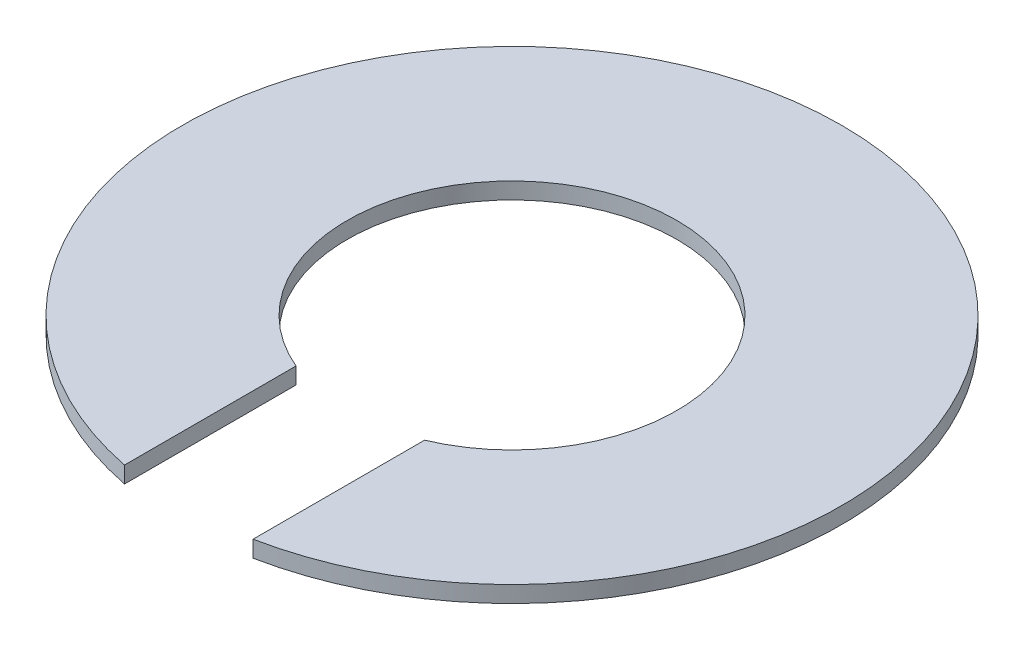
ISO-10303-21;
HEADER;
FILE_DESCRIPTION(('STEP AP214'),'2;1');
FILE_NAME('part.step','',(''),(''),'','','');
FILE_SCHEMA(('AUTOMOTIVE_DESIGN { 1 0 10303 214 1 1 1 1 }'));
ENDSEC;
DATA;
#1=APPLICATION_CONTEXT('core data for automotive mechanical design processes');
#2=APPLICATION_PROTOCOL_DEFINITION('international standard','automotive_design',2000,#1);
#3=PRODUCT_CONTEXT('',#1,'mechanical');
#4=PRODUCT('Part','Part','',(#3));
#5=PRODUCT_RELATED_PRODUCT_CATEGORY('part','',(#4));
#6=PRODUCT_DEFINITION_FORMATION('','',#4);
#7=PRODUCT_DEFINITION_CONTEXT('part definition',#1,'design');
#8=PRODUCT_DEFINITION('design','',#6,#7);
#9=PRODUCT_DEFINITION_SHAPE('','',#8);
#10=(LENGTH_UNIT() NAMED_UNIT(*) SI_UNIT(.MILLI.,.METRE.));
#11=(NAMED_UNIT(*) PLANE_ANGLE_UNIT() SI_UNIT($,.RADIAN.));
#12=(NAMED_UNIT(*) SI_UNIT($,.STERADIAN.) SOLID_ANGLE_UNIT());
#13=UNCERTAINTY_MEASURE_WITH_UNIT(LENGTH_MEASURE(1.E-05),#10,'distance_accuracy_value','');
#14=(GEOMETRIC_REPRESENTATION_CONTEXT(3) GLOBAL_UNCERTAINTY_ASSIGNED_CONTEXT((#13)) GLOBAL_UNIT_ASSIGNED_CONTEXT((#10,
#11,#12)) REPRESENTATION_CONTEXT('',''));
#15=CARTESIAN_POINT('',(0.,0.,0.));
#16=DIRECTION('',(0.,0.,1.));
#17=DIRECTION('',(1.,0.,0.));
#18=AXIS2_PLACEMENT_3D('',#15,#16,#17);
#19=CARTESIAN_POINT('',(0.,0.254,0.));
#20=DIRECTION('',(0.,-1.,0.));
#21=DIRECTION('',(0.,0.,-1.));
#22=AXIS2_PLACEMENT_3D('',#19,#20,#21);
#23=CYLINDRICAL_SURFACE('',#22,2.54);
#24=CARTESIAN_POINT('',(0.,0.,0.));
#25=DIRECTION('',(0.,1.,0.));
#26=DIRECTION('',(0.,0.,1.));
#27=AXIS2_PLACEMENT_3D('',#24,#25,#26);
#28=CIRCLE('',#27,2.54);
#29=CARTESIAN_POINT('',(0.990450861063572,0.,2.33893289596312));
#30=VERTEX_POINT('',#29);
#31=CARTESIAN_POINT('',(-0.990450861063572,0.,2.33893289596312));
#32=VERTEX_POINT('',#31);
#33=EDGE_CURVE('E115',#30,#32,#28,.T.);
#34=ORIENTED_EDGE('',*,*,#33,.F.);
#35=DIRECTION('',(0.,-1.,0.));
#36=VECTOR('',#35,1.);
#37=CARTESIAN_POINT('',(0.990450861063572,0.254,2.33893289596312));
#38=LINE('',#37,#36);
#39=CARTESIAN_POINT('',(0.990450861063572,0.254,2.33893289596312));
#40=VERTEX_POINT('',#39);
#41=EDGE_CURVE('E11',#40,#30,#38,.T.);
#42=ORIENTED_EDGE('',*,*,#41,.F.);
#43=CARTESIAN_POINT('',(0.,0.254,0.));
#44=DIRECTION('',(0.,1.,0.));
#45=DIRECTION('',(0.,0.,1.));
#46=AXIS2_PLACEMENT_3D('',#43,#44,#45);
#47=CIRCLE('',#46,2.54);
#48=CARTESIAN_POINT('',(-0.990450861063572,0.254,2.33893289596312));
#49=VERTEX_POINT('',#48);
#50=EDGE_CURVE('E96',#40,#49,#47,.T.);
#51=ORIENTED_EDGE('',*,*,#50,.T.);
#52=DIRECTION('',(0.,-1.,0.));
#53=VECTOR('',#52,1.);
#54=CARTESIAN_POINT('',(-0.990450861063572,0.254,2.33893289596312));
#55=LINE('',#54,#53);
#56=EDGE_CURVE('E64',#49,#32,#55,.T.);
#57=ORIENTED_EDGE('',*,*,#56,.T.);
#58=EDGE_LOOP('',(#34,#42,#51,#57));
#59=FACE_BOUND('',#58,.T.);
#60=ADVANCED_FACE('F47',(#59),#23,.F.);
#61=CARTESIAN_POINT('',(0.990450861063572,0.254,0.));
#62=DIRECTION('',(1.,0.,0.));
#63=DIRECTION('',(0.,0.,-1.));
#64=AXIS2_PLACEMENT_3D('',#61,#62,#63);
#65=PLANE('',#64);
#66=DIRECTION('',(0.,0.,1.));
#67=VECTOR('',#66,1.);
#68=CARTESIAN_POINT('',(0.990450861063572,0.,0.));
#69=LINE('',#68,#67);
#70=CARTESIAN_POINT('',(0.990450861063572,0.,4.98251011959017));
#71=VERTEX_POINT('',#70);
#72=EDGE_CURVE('E103',#30,#71,#69,.T.);
#73=ORIENTED_EDGE('',*,*,#72,.T.);
#74=DIRECTION('',(0.,-1.,0.));
#75=VECTOR('',#74,1.);
#76=CARTESIAN_POINT('',(0.990450861063572,0.254,4.98251011959017));
#77=LINE('',#76,#75);
#78=CARTESIAN_POINT('',(0.990450861063572,0.254,4.98251011959017));
#79=VERTEX_POINT('',#78);
#80=EDGE_CURVE('E56',#79,#71,#77,.T.);
#81=ORIENTED_EDGE('',*,*,#80,.F.);
#82=DIRECTION('',(0.,0.,1.));
#83=VECTOR('',#82,1.);
#84=CARTESIAN_POINT('',(0.990450861063572,0.254,0.));
#85=LINE('',#84,#83);
#86=EDGE_CURVE('E90',#40,#79,#85,.T.);
#87=ORIENTED_EDGE('',*,*,#86,.F.);
#88=ORIENTED_EDGE('',*,*,#41,.T.);
#89=EDGE_LOOP('',(#73,#81,#87,#88));
#90=FACE_BOUND('',#89,.T.);
#91=ADVANCED_FACE('F101',(#90),#65,.F.);
#92=CARTESIAN_POINT('',(0.,0.254,0.));
#93=DIRECTION('',(0.,-1.,0.));
#94=DIRECTION('',(0.,0.,-1.));
#95=AXIS2_PLACEMENT_3D('',#92,#93,#94);
#96=CYLINDRICAL_SURFACE('',#95,5.08);
#97=CARTESIAN_POINT('',(0.,0.,0.));
#98=DIRECTION('',(0.,1.,0.));
#99=DIRECTION('',(0.,0.,1.));
#100=AXIS2_PLACEMENT_3D('',#97,#98,#99);
#101=CIRCLE('',#100,5.08);
#102=CARTESIAN_POINT('',(-0.990450861063572,0.,4.98251011959017));
#103=VERTEX_POINT('',#102);
#104=EDGE_CURVE('E120',#71,#103,#101,.T.);
#105=ORIENTED_EDGE('',*,*,#104,.T.);
#106=DIRECTION('',(0.,-1.,0.));
#107=VECTOR('',#106,1.);
#108=CARTESIAN_POINT('',(-0.990450861063572,0.254,4.98251011959017));
#109=LINE('',#108,#107);
#110=CARTESIAN_POINT('',(-0.990450861063572,0.254,4.98251011959017));
#111=VERTEX_POINT('',#110);
#112=EDGE_CURVE('E78',#111,#103,#109,.T.);
#113=ORIENTED_EDGE('',*,*,#112,.F.);
#114=CARTESIAN_POINT('',(0.,0.254,0.));
#115=DIRECTION('',(0.,1.,0.));
#116=DIRECTION('',(0.,0.,1.));
#117=AXIS2_PLACEMENT_3D('',#114,#115,#116);
#118=CIRCLE('',#117,5.08);
#119=EDGE_CURVE('E95',#79,#111,#118,.T.);
#120=ORIENTED_EDGE('',*,*,#119,.F.);
#121=ORIENTED_EDGE('',*,*,#80,.T.);
#122=EDGE_LOOP('',(#105,#113,#120,#121));
#123=FACE_BOUND('',#122,.T.);
#124=ADVANCED_FACE('F107',(#123),#96,.T.);
#125=CARTESIAN_POINT('',(-0.990450861063572,0.254,0.));
#126=DIRECTION('',(1.,0.,0.));
#127=DIRECTION('',(0.,0.,-1.));
#128=AXIS2_PLACEMENT_3D('',#125,#126,#127);
#129=PLANE('',#128);
#130=DIRECTION('',(0.,0.,1.));
#131=VECTOR('',#130,1.);
#132=CARTESIAN_POINT('',(-0.990450861063572,0.,0.));
#133=LINE('',#132,#131);
#134=EDGE_CURVE('E123',#32,#103,#133,.T.);
#135=ORIENTED_EDGE('',*,*,#134,.F.);
#136=ORIENTED_EDGE('',*,*,#56,.F.);
#137=DIRECTION('',(0.,0.,1.));
#138=VECTOR('',#137,1.);
#139=CARTESIAN_POINT('',(-0.990450861063572,0.254,0.));
#140=LINE('',#139,#138);
#141=EDGE_CURVE('E109',#49,#111,#140,.T.);
#142=ORIENTED_EDGE('',*,*,#141,.T.);
#143=ORIENTED_EDGE('',*,*,#112,.T.);
#144=EDGE_LOOP('',(#135,#136,#142,#143));
#145=FACE_BOUND('',#144,.T.);
#146=ADVANCED_FACE('F132',(#145),#129,.T.);
#147=CARTESIAN_POINT('',(0.,0.254,0.));
#148=DIRECTION('',(0.,1.,0.));
#149=DIRECTION('',(0.,0.,1.));
#150=AXIS2_PLACEMENT_3D('',#147,#148,#149);
#151=PLANE('',#150);
#152=ORIENTED_EDGE('',*,*,#50,.F.);
#153=ORIENTED_EDGE('',*,*,#86,.T.);
#154=ORIENTED_EDGE('',*,*,#119,.T.);
#155=ORIENTED_EDGE('',*,*,#141,.F.);
#156=EDGE_LOOP('',(#152,#153,#154,#155));
#157=FACE_BOUND('',#156,.T.);
#158=ADVANCED_FACE('F92',(#157),#151,.T.);
#159=CARTESIAN_POINT('',(0.,0.,0.));
#160=DIRECTION('',(0.,1.,0.));
#161=DIRECTION('',(0.,0.,1.));
#162=AXIS2_PLACEMENT_3D('',#159,#160,#161);
#163=PLANE('',#162);
#164=ORIENTED_EDGE('',*,*,#33,.T.);
#165=ORIENTED_EDGE('',*,*,#134,.T.);
#166=ORIENTED_EDGE('',*,*,#104,.F.);
#167=ORIENTED_EDGE('',*,*,#72,.F.);
#168=EDGE_LOOP('',(#164,#165,#166,#167));
#169=FACE_BOUND('',#168,.T.);
#170=ADVANCED_FACE('F139',(#169),#163,.F.);
#171=CLOSED_SHELL('',(#60,#91,#124,#146,#158,#170));
#172=MANIFOLD_SOLID_BREP('B2',#171);
#173=ADVANCED_BREP_SHAPE_REPRESENTATION('',(#18,#172),#14);
#174=SHAPE_DEFINITION_REPRESENTATION(#9,#173);
ENDSEC;
END-ISO-10303-21;
